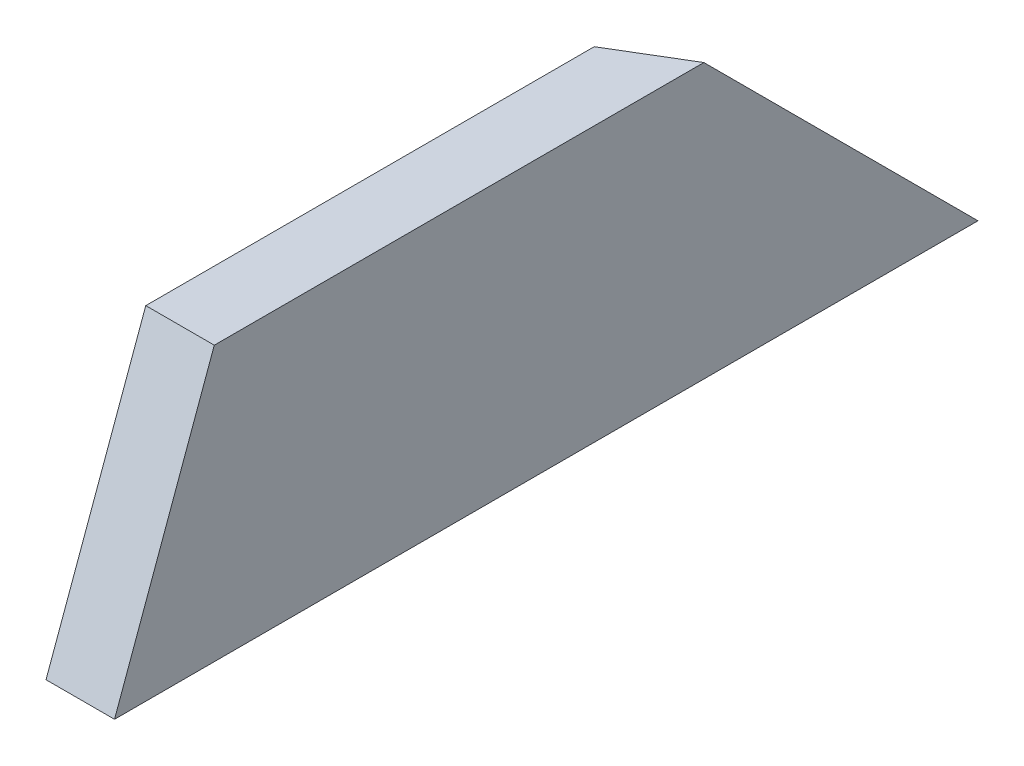
ISO-10303-21;
HEADER;
FILE_DESCRIPTION(('STEP AP214'),'2;1');
FILE_NAME('part.step','',(''),(''),'','','');
FILE_SCHEMA(('AUTOMOTIVE_DESIGN { 1 0 10303 214 1 1 1 1 }'));
ENDSEC;
DATA;
#1=APPLICATION_CONTEXT('core data for automotive mechanical design processes');
#2=APPLICATION_PROTOCOL_DEFINITION('international standard','automotive_design',2000,#1);
#3=PRODUCT_CONTEXT('',#1,'mechanical');
#4=PRODUCT('Part','Part','',(#3));
#5=PRODUCT_RELATED_PRODUCT_CATEGORY('part','',(#4));
#6=PRODUCT_DEFINITION_FORMATION('','',#4);
#7=PRODUCT_DEFINITION_CONTEXT('part definition',#1,'design');
#8=PRODUCT_DEFINITION('design','',#6,#7);
#9=PRODUCT_DEFINITION_SHAPE('','',#8);
#10=(LENGTH_UNIT() NAMED_UNIT(*) SI_UNIT(.MILLI.,.METRE.));
#11=(NAMED_UNIT(*) PLANE_ANGLE_UNIT() SI_UNIT($,.RADIAN.));
#12=(NAMED_UNIT(*) SI_UNIT($,.STERADIAN.) SOLID_ANGLE_UNIT());
#13=UNCERTAINTY_MEASURE_WITH_UNIT(LENGTH_MEASURE(1.E-05),#10,'distance_accuracy_value','');
#14=(GEOMETRIC_REPRESENTATION_CONTEXT(3) GLOBAL_UNCERTAINTY_ASSIGNED_CONTEXT((#13)) GLOBAL_UNIT_ASSIGNED_CONTEXT((#10,
#11,#12)) REPRESENTATION_CONTEXT('',''));
#15=CARTESIAN_POINT('',(0.,0.,0.));
#16=DIRECTION('',(0.,0.,1.));
#17=DIRECTION('',(1.,0.,0.));
#18=AXIS2_PLACEMENT_3D('',#15,#16,#17);
#19=CARTESIAN_POINT('',(12.7,50.8,-29.2099999999995));
#20=DIRECTION('',(0.,-1.,0.));
#21=DIRECTION('',(0.,0.,-1.));
#22=AXIS2_PLACEMENT_3D('',#19,#20,#21);
#23=PLANE('',#22);
#24=DIRECTION('',(0.,0.,1.));
#25=VECTOR('',#24,1.);
#26=CARTESIAN_POINT('',(12.7,50.8,-29.2099999999995));
#27=LINE('',#26,#25);
#28=CARTESIAN_POINT('',(12.7,50.8,-29.2099999999994));
#29=VERTEX_POINT('',#28);
#30=CARTESIAN_POINT('',(12.7,50.8,61.5203120992767));
#31=VERTEX_POINT('',#30);
#32=EDGE_CURVE('E87',#29,#31,#27,.T.);
#33=ORIENTED_EDGE('',*,*,#32,.F.);
#34=DIRECTION('',(0.857492925712544,0.,-0.514495755427526));
#35=VECTOR('',#34,1.);
#36=CARTESIAN_POINT('',(7.12280012456409,50.8,-25.8636800747379));
#37=LINE('',#36,#35);
#38=CARTESIAN_POINT('',(0.,50.8,-21.5899999999995));
#39=VERTEX_POINT('',#38);
#40=EDGE_CURVE('E91',#39,#29,#37,.T.);
#41=ORIENTED_EDGE('',*,*,#40,.F.);
#42=DIRECTION('',(0.,0.,1.));
#43=VECTOR('',#42,1.);
#44=CARTESIAN_POINT('',(0.,50.8,-29.2099999999995));
#45=LINE('',#44,#43);
#46=CARTESIAN_POINT('',(0.,50.8,61.5203120992767));
#47=VERTEX_POINT('',#46);
#48=EDGE_CURVE('E76',#39,#47,#45,.T.);
#49=ORIENTED_EDGE('',*,*,#48,.T.);
#50=DIRECTION('',(-1.,0.,0.));
#51=VECTOR('',#50,1.);
#52=CARTESIAN_POINT('',(12.7,50.8,61.5203120992767));
#53=LINE('',#52,#51);
#54=EDGE_CURVE('E11',#31,#47,#53,.T.);
#55=ORIENTED_EDGE('',*,*,#54,.F.);
#56=EDGE_LOOP('',(#33,#41,#49,#55));
#57=FACE_BOUND('',#56,.T.);
#58=ADVANCED_FACE('F32',(#57),#23,.F.);
#59=CARTESIAN_POINT('',(12.7,50.8,61.5203120992767));
#60=DIRECTION('',(0.,-0.342020143325673,-0.939692620785907));
#61=DIRECTION('',(0.,0.939692620785907,-0.342020143325673));
#62=AXIS2_PLACEMENT_3D('',#59,#60,#61);
#63=PLANE('',#62);
#64=DIRECTION('',(0.,-0.939692620785907,0.342020143325673));
#65=VECTOR('',#64,1.);
#66=CARTESIAN_POINT('',(0.,50.8,61.5203120992767));
#67=LINE('',#66,#65);
#68=CARTESIAN_POINT('',(0.,0.,80.01));
#69=VERTEX_POINT('',#68);
#70=EDGE_CURVE('E67',#47,#69,#67,.T.);
#71=ORIENTED_EDGE('',*,*,#70,.T.);
#72=DIRECTION('',(-1.,0.,0.));
#73=VECTOR('',#72,1.);
#74=CARTESIAN_POINT('',(12.7,0.,80.01));
#75=LINE('',#74,#73);
#76=CARTESIAN_POINT('',(12.7,0.,80.01));
#77=VERTEX_POINT('',#76);
#78=EDGE_CURVE('E39',#77,#69,#75,.T.);
#79=ORIENTED_EDGE('',*,*,#78,.F.);
#80=DIRECTION('',(0.,-0.939692620785907,0.342020143325673));
#81=VECTOR('',#80,1.);
#82=CARTESIAN_POINT('',(12.7,50.8,61.5203120992767));
#83=LINE('',#82,#81);
#84=EDGE_CURVE('E55',#31,#77,#83,.T.);
#85=ORIENTED_EDGE('',*,*,#84,.F.);
#86=ORIENTED_EDGE('',*,*,#54,.T.);
#87=EDGE_LOOP('',(#71,#79,#85,#86));
#88=FACE_BOUND('',#87,.T.);
#89=ADVANCED_FACE('F69',(#88),#63,.F.);
#90=CARTESIAN_POINT('',(12.7,0.,80.01));
#91=DIRECTION('',(0.,1.,0.));
#92=DIRECTION('',(0.,0.,1.));
#93=AXIS2_PLACEMENT_3D('',#90,#91,#92);
#94=PLANE('',#93);
#95=DIRECTION('',(0.,0.,-1.));
#96=VECTOR('',#95,1.);
#97=CARTESIAN_POINT('',(0.,0.,80.01));
#98=LINE('',#97,#96);
#99=CARTESIAN_POINT('',(0.,0.,-72.39));
#100=VERTEX_POINT('',#99);
#101=EDGE_CURVE('E75',#69,#100,#98,.T.);
#102=ORIENTED_EDGE('',*,*,#101,.T.);
#103=DIRECTION('',(-0.857492925712544,0.,0.514495755427526));
#104=VECTOR('',#103,1.);
#105=CARTESIAN_POINT('',(12.7,0.,-80.01));
#106=LINE('',#105,#104);
#107=CARTESIAN_POINT('',(12.7,0.,-80.01));
#108=VERTEX_POINT('',#107);
#109=EDGE_CURVE('E46',#108,#100,#106,.T.);
#110=ORIENTED_EDGE('',*,*,#109,.F.);
#111=DIRECTION('',(0.,0.,-1.));
#112=VECTOR('',#111,1.);
#113=CARTESIAN_POINT('',(12.7,0.,80.01));
#114=LINE('',#113,#112);
#115=EDGE_CURVE('E81',#77,#108,#114,.T.);
#116=ORIENTED_EDGE('',*,*,#115,.F.);
#117=ORIENTED_EDGE('',*,*,#78,.T.);
#118=EDGE_LOOP('',(#102,#110,#116,#117));
#119=FACE_BOUND('',#118,.T.);
#120=ADVANCED_FACE('F80',(#119),#94,.F.);
#121=CARTESIAN_POINT('',(12.7,0.,0.));
#122=DIRECTION('',(1.,0.,0.));
#123=DIRECTION('',(0.,0.,-1.));
#124=AXIS2_PLACEMENT_3D('',#121,#122,#123);
#125=PLANE('',#124);
#126=DIRECTION('',(0.,0.707106781186544,0.707106781186551));
#127=VECTOR('',#126,1.);
#128=CARTESIAN_POINT('',(12.7,0.,-80.01));
#129=LINE('',#128,#127);
#130=EDGE_CURVE('E84',#108,#29,#129,.T.);
#131=ORIENTED_EDGE('',*,*,#130,.T.);
#132=ORIENTED_EDGE('',*,*,#32,.T.);
#133=ORIENTED_EDGE('',*,*,#84,.T.);
#134=ORIENTED_EDGE('',*,*,#115,.T.);
#135=EDGE_LOOP('',(#131,#132,#133,#134));
#136=FACE_BOUND('',#135,.T.);
#137=ADVANCED_FACE('F105',(#136),#125,.T.);
#138=CARTESIAN_POINT('',(0.,0.,0.));
#139=DIRECTION('',(1.,0.,0.));
#140=DIRECTION('',(0.,0.,-1.));
#141=AXIS2_PLACEMENT_3D('',#138,#139,#140);
#142=PLANE('',#141);
#143=ORIENTED_EDGE('',*,*,#48,.F.);
#144=DIRECTION('',(0.,-0.707106781186544,-0.707106781186552));
#145=VECTOR('',#144,1.);
#146=CARTESIAN_POINT('',(0.,63.4416530509879,-8.94834694901139));
#147=LINE('',#146,#145);
#148=EDGE_CURVE('E83',#39,#100,#147,.T.);
#149=ORIENTED_EDGE('',*,*,#148,.T.);
#150=ORIENTED_EDGE('',*,*,#101,.F.);
#151=ORIENTED_EDGE('',*,*,#70,.F.);
#152=EDGE_LOOP('',(#143,#149,#150,#151));
#153=FACE_BOUND('',#152,.T.);
#154=ADVANCED_FACE('F82',(#153),#142,.F.);
#155=CARTESIAN_POINT('',(12.7,63.4416530509879,-16.5683469490114));
#156=DIRECTION('',(0.390566732942469,-0.650944554904124,0.650944554904116));
#157=DIRECTION('',(0.,-0.707106781186544,-0.707106781186552));
#158=AXIS2_PLACEMENT_3D('',#155,#156,#157);
#159=PLANE('',#158);
#160=ORIENTED_EDGE('',*,*,#40,.T.);
#161=ORIENTED_EDGE('',*,*,#130,.F.);
#162=ORIENTED_EDGE('',*,*,#109,.T.);
#163=ORIENTED_EDGE('',*,*,#148,.F.);
#164=EDGE_LOOP('',(#160,#161,#162,#163));
#165=FACE_BOUND('',#164,.T.);
#166=ADVANCED_FACE('F101',(#165),#159,.F.);
#167=CLOSED_SHELL('',(#58,#89,#120,#137,#154,#166));
#168=MANIFOLD_SOLID_BREP('B2',#167);
#169=ADVANCED_BREP_SHAPE_REPRESENTATION('',(#18,#168),#14);
#170=SHAPE_DEFINITION_REPRESENTATION(#9,#169);
ENDSEC;
END-ISO-10303-21;
